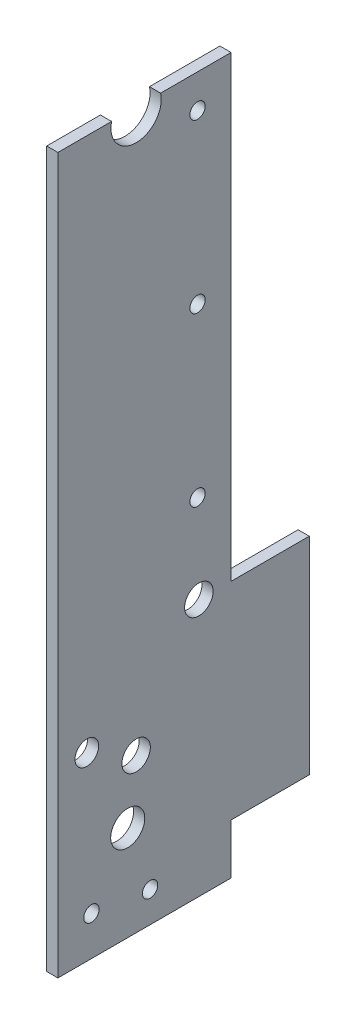
ISO-10303-21;
HEADER;
FILE_DESCRIPTION(('STEP AP214'),'2;1');
FILE_NAME('part.step','',(''),(''),'','','');
FILE_SCHEMA(('AUTOMOTIVE_DESIGN { 1 0 10303 214 1 1 1 1 }'));
ENDSEC;
DATA;
#1=APPLICATION_CONTEXT('core data for automotive mechanical design processes');
#2=APPLICATION_PROTOCOL_DEFINITION('international standard','automotive_design',2000,#1);
#3=PRODUCT_CONTEXT('',#1,'mechanical');
#4=PRODUCT('Part','Part','',(#3));
#5=PRODUCT_RELATED_PRODUCT_CATEGORY('part','',(#4));
#6=PRODUCT_DEFINITION_FORMATION('','',#4);
#7=PRODUCT_DEFINITION_CONTEXT('part definition',#1,'design');
#8=PRODUCT_DEFINITION('design','',#6,#7);
#9=PRODUCT_DEFINITION_SHAPE('','',#8);
#10=(LENGTH_UNIT() NAMED_UNIT(*) SI_UNIT(.MILLI.,.METRE.));
#11=(NAMED_UNIT(*) PLANE_ANGLE_UNIT() SI_UNIT($,.RADIAN.));
#12=(NAMED_UNIT(*) SI_UNIT($,.STERADIAN.) SOLID_ANGLE_UNIT());
#13=UNCERTAINTY_MEASURE_WITH_UNIT(LENGTH_MEASURE(1.E-05),#10,'distance_accuracy_value','');
#14=(GEOMETRIC_REPRESENTATION_CONTEXT(3) GLOBAL_UNCERTAINTY_ASSIGNED_CONTEXT((#13)) GLOBAL_UNIT_ASSIGNED_CONTEXT((#10,
#11,#12)) REPRESENTATION_CONTEXT('',''));
#15=CARTESIAN_POINT('',(0.,0.,0.));
#16=DIRECTION('',(0.,0.,1.));
#17=DIRECTION('',(1.,0.,0.));
#18=AXIS2_PLACEMENT_3D('',#15,#16,#17);
#19=CARTESIAN_POINT('',(0.,72.,18.));
#20=DIRECTION('',(0.,1.,0.));
#21=DIRECTION('',(0.,0.,1.));
#22=AXIS2_PLACEMENT_3D('',#19,#20,#21);
#23=PLANE('',#22);
#24=DIRECTION('',(1.,0.,0.));
#25=VECTOR('',#24,1.);
#26=CARTESIAN_POINT('',(-2.3,72.,60.7749643873921));
#27=LINE('',#26,#25);
#28=CARTESIAN_POINT('',(-2.,72.,60.7749643873921));
#29=VERTEX_POINT('',#28);
#30=CARTESIAN_POINT('',(2.,72.,60.7749643873921));
#31=VERTEX_POINT('',#30);
#32=EDGE_CURVE('E30',#29,#31,#27,.T.);
#33=ORIENTED_EDGE('',*,*,#32,.F.);
#34=DIRECTION('',(0.,0.,1.));
#35=VECTOR('',#34,1.);
#36=CARTESIAN_POINT('',(-2.,72.,18.));
#37=LINE('',#36,#35);
#38=CARTESIAN_POINT('',(-2.,72.,80.));
#39=VERTEX_POINT('',#38);
#40=EDGE_CURVE('E108',#29,#39,#37,.T.);
#41=ORIENTED_EDGE('',*,*,#40,.T.);
#42=DIRECTION('',(1.,0.,0.));
#43=VECTOR('',#42,1.);
#44=CARTESIAN_POINT('',(0.,72.,80.));
#45=LINE('',#44,#43);
#46=CARTESIAN_POINT('',(2.,72.,80.));
#47=VERTEX_POINT('',#46);
#48=EDGE_CURVE('E122',#39,#47,#45,.T.);
#49=ORIENTED_EDGE('',*,*,#48,.T.);
#50=DIRECTION('',(0.,0.,1.));
#51=VECTOR('',#50,1.);
#52=CARTESIAN_POINT('',(2.,72.,18.));
#53=LINE('',#52,#51);
#54=EDGE_CURVE('E109',#31,#47,#53,.T.);
#55=ORIENTED_EDGE('',*,*,#54,.F.);
#56=EDGE_LOOP('',(#33,#41,#49,#55));
#57=FACE_BOUND('',#56,.T.);
#58=ADVANCED_FACE('F16',(#57),#23,.T.);
#59=CARTESIAN_POINT('',(0.,-56.,18.));
#60=DIRECTION('',(0.,0.,-1.));
#61=DIRECTION('',(-1.,0.,0.));
#62=AXIS2_PLACEMENT_3D('',#59,#60,#61);
#63=PLANE('',#62);
#64=DIRECTION('',(-1.,0.,0.));
#65=VECTOR('',#64,1.);
#66=CARTESIAN_POINT('',(0.,-166.,18.));
#67=LINE('',#66,#65);
#68=CARTESIAN_POINT('',(2.,-166.,18.));
#69=VERTEX_POINT('',#68);
#70=CARTESIAN_POINT('',(-2.,-166.,18.));
#71=VERTEX_POINT('',#70);
#72=EDGE_CURVE('E208',#69,#71,#67,.T.);
#73=ORIENTED_EDGE('',*,*,#72,.F.);
#74=DIRECTION('',(0.,1.,0.));
#75=VECTOR('',#74,1.);
#76=CARTESIAN_POINT('',(2.,-56.,18.));
#77=LINE('',#76,#75);
#78=CARTESIAN_POINT('',(2.,-184.,18.));
#79=VERTEX_POINT('',#78);
#80=EDGE_CURVE('E214',#79,#69,#77,.T.);
#81=ORIENTED_EDGE('',*,*,#80,.F.);
#82=DIRECTION('',(1.,0.,0.));
#83=VECTOR('',#82,1.);
#84=CARTESIAN_POINT('',(0.,-184.,18.));
#85=LINE('',#84,#83);
#86=CARTESIAN_POINT('',(-2.,-184.,18.));
#87=VERTEX_POINT('',#86);
#88=EDGE_CURVE('E210',#87,#79,#85,.T.);
#89=ORIENTED_EDGE('',*,*,#88,.F.);
#90=DIRECTION('',(0.,-1.,0.));
#91=VECTOR('',#90,1.);
#92=CARTESIAN_POINT('',(-2.,-56.,18.));
#93=LINE('',#92,#91);
#94=EDGE_CURVE('E213',#71,#87,#93,.T.);
#95=ORIENTED_EDGE('',*,*,#94,.F.);
#96=EDGE_LOOP('',(#73,#81,#89,#95));
#97=FACE_BOUND('',#96,.T.);
#98=ADVANCED_FACE('F234',(#97),#63,.T.);
#99=CARTESIAN_POINT('',(0.,-56.,80.));
#100=DIRECTION('',(0.,0.,1.));
#101=DIRECTION('',(1.,0.,0.));
#102=AXIS2_PLACEMENT_3D('',#99,#100,#101);
#103=PLANE('',#102);
#104=DIRECTION('',(-1.,0.,0.));
#105=VECTOR('',#104,1.);
#106=CARTESIAN_POINT('',(0.,-184.,80.));
#107=LINE('',#106,#105);
#108=CARTESIAN_POINT('',(2.,-184.,80.));
#109=VERTEX_POINT('',#108);
#110=CARTESIAN_POINT('',(-2.,-184.,80.));
#111=VERTEX_POINT('',#110);
#112=EDGE_CURVE('E24',#109,#111,#107,.T.);
#113=ORIENTED_EDGE('',*,*,#112,.F.);
#114=DIRECTION('',(0.,-1.,0.));
#115=VECTOR('',#114,1.);
#116=CARTESIAN_POINT('',(2.,-56.,80.));
#117=LINE('',#116,#115);
#118=EDGE_CURVE('E119',#47,#109,#117,.T.);
#119=ORIENTED_EDGE('',*,*,#118,.F.);
#120=ORIENTED_EDGE('',*,*,#48,.F.);
#121=DIRECTION('',(0.,1.,0.));
#122=VECTOR('',#121,1.);
#123=CARTESIAN_POINT('',(-2.,-56.,80.));
#124=LINE('',#123,#122);
#125=EDGE_CURVE('E125',#111,#39,#124,.T.);
#126=ORIENTED_EDGE('',*,*,#125,.F.);
#127=EDGE_LOOP('',(#113,#119,#120,#126));
#128=FACE_BOUND('',#127,.T.);
#129=ADVANCED_FACE('F18',(#128),#103,.T.);
#130=CARTESIAN_POINT('',(0.,-184.,18.));
#131=DIRECTION('',(0.,-1.,0.));
#132=DIRECTION('',(0.,0.,-1.));
#133=AXIS2_PLACEMENT_3D('',#130,#131,#132);
#134=PLANE('',#133);
#135=DIRECTION('',(0.,0.,1.));
#136=VECTOR('',#135,1.);
#137=CARTESIAN_POINT('',(2.,-184.,18.));
#138=LINE('',#137,#136);
#139=EDGE_CURVE('E112',#79,#109,#138,.T.);
#140=ORIENTED_EDGE('',*,*,#139,.T.);
#141=ORIENTED_EDGE('',*,*,#112,.T.);
#142=DIRECTION('',(0.,0.,1.));
#143=VECTOR('',#142,1.);
#144=CARTESIAN_POINT('',(-2.,-184.,18.));
#145=LINE('',#144,#143);
#146=EDGE_CURVE('E116',#87,#111,#145,.T.);
#147=ORIENTED_EDGE('',*,*,#146,.F.);
#148=ORIENTED_EDGE('',*,*,#88,.T.);
#149=EDGE_LOOP('',(#140,#141,#147,#148));
#150=FACE_BOUND('',#149,.T.);
#151=ADVANCED_FACE('F231',(#150),#134,.T.);
#152=CARTESIAN_POINT('',(-2.,-56.,18.));
#153=DIRECTION('',(-1.,0.,0.));
#154=DIRECTION('',(0.,0.,1.));
#155=AXIS2_PLACEMENT_3D('',#152,#153,#154);
#156=PLANE('',#155);
#157=CARTESIAN_POINT('',(-2.,70.,52.));
#158=DIRECTION('',(-1.,0.,0.));
#159=DIRECTION('',(0.,0.,1.));
#160=AXIS2_PLACEMENT_3D('',#157,#158,#159);
#161=CIRCLE('',#160,9.);
#162=CARTESIAN_POINT('',(-2.,72.,43.2250356126079));
#163=VERTEX_POINT('',#162);
#164=EDGE_CURVE('E163',#163,#29,#161,.T.);
#165=ORIENTED_EDGE('',*,*,#164,.F.);
#166=CARTESIAN_POINT('',(-2.,72.,18.));
#167=VERTEX_POINT('',#166);
#168=EDGE_CURVE('E102',#167,#163,#37,.T.);
#169=ORIENTED_EDGE('',*,*,#168,.F.);
#170=CARTESIAN_POINT('',(-2.,-92.,18.));
#171=VERTEX_POINT('',#170);
#172=EDGE_CURVE('E218',#167,#171,#93,.T.);
#173=ORIENTED_EDGE('',*,*,#172,.T.);
#174=DIRECTION('',(0.,0.,1.));
#175=VECTOR('',#174,1.);
#176=CARTESIAN_POINT('',(-2.,-92.,-10.));
#177=LINE('',#176,#175);
#178=CARTESIAN_POINT('',(-2.,-92.,-10.));
#179=VERTEX_POINT('',#178);
#180=EDGE_CURVE('E201',#179,#171,#177,.T.);
#181=ORIENTED_EDGE('',*,*,#180,.F.);
#182=DIRECTION('',(0.,-1.,0.));
#183=VECTOR('',#182,1.);
#184=CARTESIAN_POINT('',(-2.,-129.,-10.));
#185=LINE('',#184,#183);
#186=CARTESIAN_POINT('',(-2.,-166.,-10.));
#187=VERTEX_POINT('',#186);
#188=EDGE_CURVE('E190',#179,#187,#185,.T.);
#189=ORIENTED_EDGE('',*,*,#188,.T.);
#190=DIRECTION('',(0.,0.,1.));
#191=VECTOR('',#190,1.);
#192=CARTESIAN_POINT('',(-2.,-166.,-10.));
#193=LINE('',#192,#191);
#194=EDGE_CURVE('E203',#187,#71,#193,.T.);
#195=ORIENTED_EDGE('',*,*,#194,.T.);
#196=ORIENTED_EDGE('',*,*,#94,.T.);
#197=ORIENTED_EDGE('',*,*,#146,.T.);
#198=ORIENTED_EDGE('',*,*,#125,.T.);
#199=ORIENTED_EDGE('',*,*,#40,.F.);
#200=EDGE_LOOP('',(#165,#169,#173,#181,#189,#195,#196,#197,#198,#199));
#201=FACE_BOUND('',#200,.T.);
#202=CARTESIAN_POINT('',(-2.,60.,30.));
#203=DIRECTION('',(-1.,0.,0.));
#204=DIRECTION('',(0.,0.,1.));
#205=AXIS2_PLACEMENT_3D('',#202,#203,#204);
#206=CIRCLE('',#205,2.75);
#207=CARTESIAN_POINT('',(-2.,60.,32.75));
#208=VERTEX_POINT('',#207);
#209=EDGE_CURVE('E160',#208,#208,#206,.T.);
#210=ORIENTED_EDGE('',*,*,#209,.F.);
#211=EDGE_LOOP('',(#210));
#212=FACE_BOUND('',#211,.T.);
#213=CARTESIAN_POINT('',(-2.,0.,30.));
#214=DIRECTION('',(-1.,0.,0.));
#215=DIRECTION('',(0.,0.,1.));
#216=AXIS2_PLACEMENT_3D('',#213,#214,#215);
#217=CIRCLE('',#216,2.75);
#218=CARTESIAN_POINT('',(-2.,0.,32.75));
#219=VERTEX_POINT('',#218);
#220=EDGE_CURVE('E157',#219,#219,#217,.T.);
#221=ORIENTED_EDGE('',*,*,#220,.F.);
#222=EDGE_LOOP('',(#221));
#223=FACE_BOUND('',#222,.T.);
#224=CARTESIAN_POINT('',(-2.,-60.,30.));
#225=DIRECTION('',(-1.,0.,0.));
#226=DIRECTION('',(0.,0.,1.));
#227=AXIS2_PLACEMENT_3D('',#224,#225,#226);
#228=CIRCLE('',#227,2.75);
#229=CARTESIAN_POINT('',(-2.,-60.,32.75));
#230=VERTEX_POINT('',#229);
#231=EDGE_CURVE('E153',#230,#230,#228,.T.);
#232=ORIENTED_EDGE('',*,*,#231,.F.);
#233=EDGE_LOOP('',(#232));
#234=FACE_BOUND('',#233,.T.);
#235=CARTESIAN_POINT('',(-2.,-170.,68.));
#236=DIRECTION('',(-1.,0.,0.));
#237=DIRECTION('',(0.,0.,1.));
#238=AXIS2_PLACEMENT_3D('',#235,#236,#237);
#239=CIRCLE('',#238,2.75);
#240=CARTESIAN_POINT('',(-2.,-170.,70.75));
#241=VERTEX_POINT('',#240);
#242=EDGE_CURVE('E149',#241,#241,#239,.T.);
#243=ORIENTED_EDGE('',*,*,#242,.F.);
#244=EDGE_LOOP('',(#243));
#245=FACE_BOUND('',#244,.T.);
#246=CARTESIAN_POINT('',(-2.,-173.,47.));
#247=DIRECTION('',(-1.,0.,0.));
#248=DIRECTION('',(0.,0.,1.));
#249=AXIS2_PLACEMENT_3D('',#246,#247,#248);
#250=CIRCLE('',#249,2.75);
#251=CARTESIAN_POINT('',(-2.,-173.,49.75));
#252=VERTEX_POINT('',#251);
#253=EDGE_CURVE('E145',#252,#252,#250,.T.);
#254=ORIENTED_EDGE('',*,*,#253,.F.);
#255=EDGE_LOOP('',(#254));
#256=FACE_BOUND('',#255,.T.);
#257=CARTESIAN_POINT('',(-2.,-119.301271317342,69.6333395005085));
#258=DIRECTION('',(-1.,0.,0.));
#259=DIRECTION('',(0.,0.,1.));
#260=AXIS2_PLACEMENT_3D('',#257,#258,#259);
#261=CIRCLE('',#260,4.25);
#262=CARTESIAN_POINT('',(-2.,-119.301271317342,73.8833395005085));
#263=VERTEX_POINT('',#262);
#264=EDGE_CURVE('E141',#263,#263,#261,.T.);
#265=ORIENTED_EDGE('',*,*,#264,.F.);
#266=EDGE_LOOP('',(#265));
#267=FACE_BOUND('',#266,.T.);
#268=CARTESIAN_POINT('',(-2.,-91.8524662929179,29.5264435506706));
#269=DIRECTION('',(-1.,0.,0.));
#270=DIRECTION('',(0.,0.,1.));
#271=AXIS2_PLACEMENT_3D('',#268,#269,#270);
#272=CIRCLE('',#271,5.1);
#273=CARTESIAN_POINT('',(-2.,-91.8524662929179,34.6264435506706));
#274=VERTEX_POINT('',#273);
#275=EDGE_CURVE('E137',#274,#274,#272,.T.);
#276=ORIENTED_EDGE('',*,*,#275,.F.);
#277=EDGE_LOOP('',(#276));
#278=FACE_BOUND('',#277,.T.);
#279=CARTESIAN_POINT('',(-2.,-150.,55.));
#280=DIRECTION('',(-1.,0.,0.));
#281=DIRECTION('',(0.,0.,1.));
#282=AXIS2_PLACEMENT_3D('',#279,#280,#281);
#283=CIRCLE('',#282,6.1);
#284=CARTESIAN_POINT('',(-2.,-150.,61.1));
#285=VERTEX_POINT('',#284);
#286=EDGE_CURVE('E133',#285,#285,#283,.T.);
#287=ORIENTED_EDGE('',*,*,#286,.F.);
#288=EDGE_LOOP('',(#287));
#289=FACE_BOUND('',#288,.T.);
#290=CARTESIAN_POINT('',(-2.,-129.,52.));
#291=DIRECTION('',(-1.,0.,0.));
#292=DIRECTION('',(0.,0.,1.));
#293=AXIS2_PLACEMENT_3D('',#290,#291,#292);
#294=CIRCLE('',#293,5.1);
#295=CARTESIAN_POINT('',(-2.,-129.,57.1));
#296=VERTEX_POINT('',#295);
#297=EDGE_CURVE('E132',#296,#296,#294,.T.);
#298=ORIENTED_EDGE('',*,*,#297,.F.);
#299=EDGE_LOOP('',(#298));
#300=FACE_BOUND('',#299,.T.);
#301=ADVANCED_FACE('F224',(#201,#212,#223,#234,#245,#256,#267,#278,#289,#300),#156,.T.);
#302=DIRECTION('',(1.,0.,0.));
#303=VECTOR('',#302,1.);
#304=CARTESIAN_POINT('',(-2.3,72.,43.2250356126079));
#305=LINE('',#304,#303);
#306=CARTESIAN_POINT('',(2.,72.,43.2250356126079));
#307=VERTEX_POINT('',#306);
#308=EDGE_CURVE('E91',#307,#163,#305,.F.);
#309=ORIENTED_EDGE('',*,*,#308,.F.);
#310=CARTESIAN_POINT('',(2.,72.,18.));
#311=VERTEX_POINT('',#310);
#312=EDGE_CURVE('E100',#311,#307,#53,.T.);
#313=ORIENTED_EDGE('',*,*,#312,.F.);
#314=DIRECTION('',(-1.,0.,0.));
#315=VECTOR('',#314,1.);
#316=CARTESIAN_POINT('',(0.,72.,18.));
#317=LINE('',#316,#315);
#318=EDGE_CURVE('E217',#311,#167,#317,.T.);
#319=ORIENTED_EDGE('',*,*,#318,.T.);
#320=ORIENTED_EDGE('',*,*,#168,.T.);
#321=EDGE_LOOP('',(#309,#313,#319,#320));
#322=FACE_BOUND('',#321,.T.);
#323=ADVANCED_FACE('F98',(#322),#23,.T.);
#324=DIRECTION('',(1.,0.,0.));
#325=VECTOR('',#324,1.);
#326=CARTESIAN_POINT('',(0.,-92.,18.));
#327=LINE('',#326,#325);
#328=CARTESIAN_POINT('',(2.,-92.,18.));
#329=VERTEX_POINT('',#328);
#330=EDGE_CURVE('E206',#171,#329,#327,.T.);
#331=ORIENTED_EDGE('',*,*,#330,.F.);
#332=ORIENTED_EDGE('',*,*,#172,.F.);
#333=ORIENTED_EDGE('',*,*,#318,.F.);
#334=EDGE_CURVE('E107',#329,#311,#77,.T.);
#335=ORIENTED_EDGE('',*,*,#334,.F.);
#336=EDGE_LOOP('',(#331,#332,#333,#335));
#337=FACE_BOUND('',#336,.T.);
#338=ADVANCED_FACE('F247',(#337),#63,.T.);
#339=CARTESIAN_POINT('',(2.,-56.,18.));
#340=DIRECTION('',(1.,0.,0.));
#341=DIRECTION('',(0.,0.,-1.));
#342=AXIS2_PLACEMENT_3D('',#339,#340,#341);
#343=PLANE('',#342);
#344=CARTESIAN_POINT('',(2.,70.,52.));
#345=DIRECTION('',(1.,0.,0.));
#346=DIRECTION('',(0.,0.,-1.));
#347=AXIS2_PLACEMENT_3D('',#344,#345,#346);
#348=CIRCLE('',#347,9.);
#349=EDGE_CURVE('E10',#31,#307,#348,.T.);
#350=ORIENTED_EDGE('',*,*,#349,.F.);
#351=ORIENTED_EDGE('',*,*,#54,.T.);
#352=ORIENTED_EDGE('',*,*,#118,.T.);
#353=ORIENTED_EDGE('',*,*,#139,.F.);
#354=ORIENTED_EDGE('',*,*,#80,.T.);
#355=DIRECTION('',(0.,0.,1.));
#356=VECTOR('',#355,1.);
#357=CARTESIAN_POINT('',(2.,-166.,-10.));
#358=LINE('',#357,#356);
#359=CARTESIAN_POINT('',(2.,-166.,-10.));
#360=VERTEX_POINT('',#359);
#361=EDGE_CURVE('E193',#360,#69,#358,.T.);
#362=ORIENTED_EDGE('',*,*,#361,.F.);
#363=DIRECTION('',(0.,1.,0.));
#364=VECTOR('',#363,1.);
#365=CARTESIAN_POINT('',(2.,-129.,-10.));
#366=LINE('',#365,#364);
#367=CARTESIAN_POINT('',(2.,-92.,-10.));
#368=VERTEX_POINT('',#367);
#369=EDGE_CURVE('E191',#360,#368,#366,.T.);
#370=ORIENTED_EDGE('',*,*,#369,.T.);
#371=DIRECTION('',(0.,0.,1.));
#372=VECTOR('',#371,1.);
#373=CARTESIAN_POINT('',(2.,-92.,-10.));
#374=LINE('',#373,#372);
#375=EDGE_CURVE('E38',#368,#329,#374,.T.);
#376=ORIENTED_EDGE('',*,*,#375,.T.);
#377=ORIENTED_EDGE('',*,*,#334,.T.);
#378=ORIENTED_EDGE('',*,*,#312,.T.);
#379=EDGE_LOOP('',(#350,#351,#352,#353,#354,#362,#370,#376,#377,#378));
#380=FACE_BOUND('',#379,.T.);
#381=CARTESIAN_POINT('',(2.,60.,30.));
#382=DIRECTION('',(1.,0.,0.));
#383=DIRECTION('',(0.,0.,-1.));
#384=AXIS2_PLACEMENT_3D('',#381,#382,#383);
#385=CIRCLE('',#384,2.75);
#386=CARTESIAN_POINT('',(2.,60.,27.25));
#387=VERTEX_POINT('',#386);
#388=EDGE_CURVE('E161',#387,#387,#385,.T.);
#389=ORIENTED_EDGE('',*,*,#388,.F.);
#390=EDGE_LOOP('',(#389));
#391=FACE_BOUND('',#390,.T.);
#392=CARTESIAN_POINT('',(2.,0.,30.));
#393=DIRECTION('',(1.,0.,0.));
#394=DIRECTION('',(0.,0.,-1.));
#395=AXIS2_PLACEMENT_3D('',#392,#393,#394);
#396=CIRCLE('',#395,2.75);
#397=CARTESIAN_POINT('',(2.,0.,27.25));
#398=VERTEX_POINT('',#397);
#399=EDGE_CURVE('E158',#398,#398,#396,.T.);
#400=ORIENTED_EDGE('',*,*,#399,.F.);
#401=EDGE_LOOP('',(#400));
#402=FACE_BOUND('',#401,.T.);
#403=CARTESIAN_POINT('',(2.,-60.,30.));
#404=DIRECTION('',(1.,0.,0.));
#405=DIRECTION('',(0.,0.,-1.));
#406=AXIS2_PLACEMENT_3D('',#403,#404,#405);
#407=CIRCLE('',#406,2.75);
#408=CARTESIAN_POINT('',(2.,-60.,27.25));
#409=VERTEX_POINT('',#408);
#410=EDGE_CURVE('E154',#409,#409,#407,.T.);
#411=ORIENTED_EDGE('',*,*,#410,.F.);
#412=EDGE_LOOP('',(#411));
#413=FACE_BOUND('',#412,.T.);
#414=CARTESIAN_POINT('',(2.,-170.,68.));
#415=DIRECTION('',(1.,0.,0.));
#416=DIRECTION('',(0.,0.,-1.));
#417=AXIS2_PLACEMENT_3D('',#414,#415,#416);
#418=CIRCLE('',#417,2.75);
#419=CARTESIAN_POINT('',(2.,-170.,65.25));
#420=VERTEX_POINT('',#419);
#421=EDGE_CURVE('E150',#420,#420,#418,.T.);
#422=ORIENTED_EDGE('',*,*,#421,.F.);
#423=EDGE_LOOP('',(#422));
#424=FACE_BOUND('',#423,.T.);
#425=CARTESIAN_POINT('',(2.,-173.,47.));
#426=DIRECTION('',(1.,0.,0.));
#427=DIRECTION('',(0.,0.,-1.));
#428=AXIS2_PLACEMENT_3D('',#425,#426,#427);
#429=CIRCLE('',#428,2.75);
#430=CARTESIAN_POINT('',(2.,-173.,44.25));
#431=VERTEX_POINT('',#430);
#432=EDGE_CURVE('E146',#431,#431,#429,.T.);
#433=ORIENTED_EDGE('',*,*,#432,.F.);
#434=EDGE_LOOP('',(#433));
#435=FACE_BOUND('',#434,.T.);
#436=CARTESIAN_POINT('',(2.,-119.301271317342,69.6333395005085));
#437=DIRECTION('',(1.,0.,0.));
#438=DIRECTION('',(0.,0.,-1.));
#439=AXIS2_PLACEMENT_3D('',#436,#437,#438);
#440=CIRCLE('',#439,4.25);
#441=CARTESIAN_POINT('',(2.,-119.301271317342,65.3833395005085));
#442=VERTEX_POINT('',#441);
#443=EDGE_CURVE('E142',#442,#442,#440,.T.);
#444=ORIENTED_EDGE('',*,*,#443,.F.);
#445=EDGE_LOOP('',(#444));
#446=FACE_BOUND('',#445,.T.);
#447=CARTESIAN_POINT('',(2.,-91.8524662929179,29.5264435506706));
#448=DIRECTION('',(1.,0.,0.));
#449=DIRECTION('',(0.,0.,-1.));
#450=AXIS2_PLACEMENT_3D('',#447,#448,#449);
#451=CIRCLE('',#450,5.1);
#452=CARTESIAN_POINT('',(2.,-91.8524662929179,24.4264435506706));
#453=VERTEX_POINT('',#452);
#454=EDGE_CURVE('E138',#453,#453,#451,.T.);
#455=ORIENTED_EDGE('',*,*,#454,.F.);
#456=EDGE_LOOP('',(#455));
#457=FACE_BOUND('',#456,.T.);
#458=CARTESIAN_POINT('',(2.,-150.,55.));
#459=DIRECTION('',(1.,0.,0.));
#460=DIRECTION('',(0.,0.,-1.));
#461=AXIS2_PLACEMENT_3D('',#458,#459,#460);
#462=CIRCLE('',#461,6.1);
#463=CARTESIAN_POINT('',(2.,-150.,48.9));
#464=VERTEX_POINT('',#463);
#465=EDGE_CURVE('E134',#464,#464,#462,.T.);
#466=ORIENTED_EDGE('',*,*,#465,.F.);
#467=EDGE_LOOP('',(#466));
#468=FACE_BOUND('',#467,.T.);
#469=CARTESIAN_POINT('',(2.,-129.,52.));
#470=DIRECTION('',(1.,0.,0.));
#471=DIRECTION('',(0.,0.,-1.));
#472=AXIS2_PLACEMENT_3D('',#469,#470,#471);
#473=CIRCLE('',#472,5.1);
#474=CARTESIAN_POINT('',(2.,-129.,46.9));
#475=VERTEX_POINT('',#474);
#476=EDGE_CURVE('E129',#475,#475,#473,.T.);
#477=ORIENTED_EDGE('',*,*,#476,.F.);
#478=EDGE_LOOP('',(#477));
#479=FACE_BOUND('',#478,.T.);
#480=ADVANCED_FACE('F104',(#380,#391,#402,#413,#424,#435,#446,#457,#468,#479),#343,.T.);
#481=CARTESIAN_POINT('',(0.,-166.,-10.));
#482=DIRECTION('',(0.,-1.,0.));
#483=DIRECTION('',(0.,0.,-1.));
#484=AXIS2_PLACEMENT_3D('',#481,#482,#483);
#485=PLANE('',#484);
#486=ORIENTED_EDGE('',*,*,#361,.T.);
#487=ORIENTED_EDGE('',*,*,#72,.T.);
#488=ORIENTED_EDGE('',*,*,#194,.F.);
#489=DIRECTION('',(1.,0.,0.));
#490=VECTOR('',#489,1.);
#491=CARTESIAN_POINT('',(0.,-166.,-10.));
#492=LINE('',#491,#490);
#493=EDGE_CURVE('E187',#187,#360,#492,.T.);
#494=ORIENTED_EDGE('',*,*,#493,.T.);
#495=EDGE_LOOP('',(#486,#487,#488,#494));
#496=FACE_BOUND('',#495,.T.);
#497=ADVANCED_FACE('F308',(#496),#485,.T.);
#498=CARTESIAN_POINT('',(0.,-92.,-10.));
#499=DIRECTION('',(0.,1.,0.));
#500=DIRECTION('',(0.,0.,1.));
#501=AXIS2_PLACEMENT_3D('',#498,#499,#500);
#502=PLANE('',#501);
#503=ORIENTED_EDGE('',*,*,#180,.T.);
#504=ORIENTED_EDGE('',*,*,#330,.T.);
#505=ORIENTED_EDGE('',*,*,#375,.F.);
#506=DIRECTION('',(-1.,0.,0.));
#507=VECTOR('',#506,1.);
#508=CARTESIAN_POINT('',(0.,-92.,-10.));
#509=LINE('',#508,#507);
#510=EDGE_CURVE('E194',#368,#179,#509,.T.);
#511=ORIENTED_EDGE('',*,*,#510,.T.);
#512=EDGE_LOOP('',(#503,#504,#505,#511));
#513=FACE_BOUND('',#512,.T.);
#514=ADVANCED_FACE('F315',(#513),#502,.T.);
#515=CARTESIAN_POINT('',(0.,-129.,-10.));
#516=DIRECTION('',(0.,0.,-1.));
#517=DIRECTION('',(-1.,0.,0.));
#518=AXIS2_PLACEMENT_3D('',#515,#516,#517);
#519=PLANE('',#518);
#520=ORIENTED_EDGE('',*,*,#369,.F.);
#521=ORIENTED_EDGE('',*,*,#493,.F.);
#522=ORIENTED_EDGE('',*,*,#188,.F.);
#523=ORIENTED_EDGE('',*,*,#510,.F.);
#524=EDGE_LOOP('',(#520,#521,#522,#523));
#525=FACE_BOUND('',#524,.T.);
#526=ADVANCED_FACE('F324',(#525),#519,.T.);
#527=CARTESIAN_POINT('',(-2.3,-129.,52.));
#528=DIRECTION('',(1.,0.,0.));
#529=DIRECTION('',(0.,0.,-1.));
#530=AXIS2_PLACEMENT_3D('',#527,#528,#529);
#531=CYLINDRICAL_SURFACE('',#530,5.1);
#532=ORIENTED_EDGE('',*,*,#297,.T.);
#533=EDGE_LOOP('',(#532));
#534=FACE_BOUND('',#533,.T.);
#535=ORIENTED_EDGE('',*,*,#476,.T.);
#536=EDGE_LOOP('',(#535));
#537=FACE_BOUND('',#536,.T.);
#538=ADVANCED_FACE('F333',(#534,#537),#531,.F.);
#539=CARTESIAN_POINT('',(-2.3,-150.,55.));
#540=DIRECTION('',(1.,0.,0.));
#541=DIRECTION('',(0.,0.,-1.));
#542=AXIS2_PLACEMENT_3D('',#539,#540,#541);
#543=CYLINDRICAL_SURFACE('',#542,6.1);
#544=ORIENTED_EDGE('',*,*,#286,.T.);
#545=EDGE_LOOP('',(#544));
#546=FACE_BOUND('',#545,.T.);
#547=ORIENTED_EDGE('',*,*,#465,.T.);
#548=EDGE_LOOP('',(#547));
#549=FACE_BOUND('',#548,.T.);
#550=ADVANCED_FACE('F342',(#546,#549),#543,.F.);
#551=CARTESIAN_POINT('',(-2.3,-91.8524662929179,29.5264435506706));
#552=DIRECTION('',(1.,0.,0.));
#553=DIRECTION('',(0.,0.,-1.));
#554=AXIS2_PLACEMENT_3D('',#551,#552,#553);
#555=CYLINDRICAL_SURFACE('',#554,5.1);
#556=ORIENTED_EDGE('',*,*,#275,.T.);
#557=EDGE_LOOP('',(#556));
#558=FACE_BOUND('',#557,.T.);
#559=ORIENTED_EDGE('',*,*,#454,.T.);
#560=EDGE_LOOP('',(#559));
#561=FACE_BOUND('',#560,.T.);
#562=ADVANCED_FACE('F351',(#558,#561),#555,.F.);
#563=CARTESIAN_POINT('',(-2.3,-119.301271317342,69.6333395005085));
#564=DIRECTION('',(1.,0.,0.));
#565=DIRECTION('',(0.,0.,-1.));
#566=AXIS2_PLACEMENT_3D('',#563,#564,#565);
#567=CYLINDRICAL_SURFACE('',#566,4.25);
#568=ORIENTED_EDGE('',*,*,#264,.T.);
#569=EDGE_LOOP('',(#568));
#570=FACE_BOUND('',#569,.T.);
#571=ORIENTED_EDGE('',*,*,#443,.T.);
#572=EDGE_LOOP('',(#571));
#573=FACE_BOUND('',#572,.T.);
#574=ADVANCED_FACE('F360',(#570,#573),#567,.F.);
#575=CARTESIAN_POINT('',(-2.3,-173.,47.));
#576=DIRECTION('',(1.,0.,0.));
#577=DIRECTION('',(0.,0.,-1.));
#578=AXIS2_PLACEMENT_3D('',#575,#576,#577);
#579=CYLINDRICAL_SURFACE('',#578,2.75);
#580=ORIENTED_EDGE('',*,*,#253,.T.);
#581=EDGE_LOOP('',(#580));
#582=FACE_BOUND('',#581,.T.);
#583=ORIENTED_EDGE('',*,*,#432,.T.);
#584=EDGE_LOOP('',(#583));
#585=FACE_BOUND('',#584,.T.);
#586=ADVANCED_FACE('F369',(#582,#585),#579,.F.);
#587=CARTESIAN_POINT('',(-2.3,-170.,68.));
#588=DIRECTION('',(1.,0.,0.));
#589=DIRECTION('',(0.,0.,-1.));
#590=AXIS2_PLACEMENT_3D('',#587,#588,#589);
#591=CYLINDRICAL_SURFACE('',#590,2.75);
#592=ORIENTED_EDGE('',*,*,#242,.T.);
#593=EDGE_LOOP('',(#592));
#594=FACE_BOUND('',#593,.T.);
#595=ORIENTED_EDGE('',*,*,#421,.T.);
#596=EDGE_LOOP('',(#595));
#597=FACE_BOUND('',#596,.T.);
#598=ADVANCED_FACE('F378',(#594,#597),#591,.F.);
#599=CARTESIAN_POINT('',(-2.3,-60.,30.));
#600=DIRECTION('',(1.,0.,0.));
#601=DIRECTION('',(0.,0.,-1.));
#602=AXIS2_PLACEMENT_3D('',#599,#600,#601);
#603=CYLINDRICAL_SURFACE('',#602,2.75);
#604=ORIENTED_EDGE('',*,*,#231,.T.);
#605=EDGE_LOOP('',(#604));
#606=FACE_BOUND('',#605,.T.);
#607=ORIENTED_EDGE('',*,*,#410,.T.);
#608=EDGE_LOOP('',(#607));
#609=FACE_BOUND('',#608,.T.);
#610=ADVANCED_FACE('F387',(#606,#609),#603,.F.);
#611=CARTESIAN_POINT('',(-2.3,0.,30.));
#612=DIRECTION('',(1.,0.,0.));
#613=DIRECTION('',(0.,0.,-1.));
#614=AXIS2_PLACEMENT_3D('',#611,#612,#613);
#615=CYLINDRICAL_SURFACE('',#614,2.75);
#616=ORIENTED_EDGE('',*,*,#220,.T.);
#617=EDGE_LOOP('',(#616));
#618=FACE_BOUND('',#617,.T.);
#619=ORIENTED_EDGE('',*,*,#399,.T.);
#620=EDGE_LOOP('',(#619));
#621=FACE_BOUND('',#620,.T.);
#622=ADVANCED_FACE('F396',(#618,#621),#615,.F.);
#623=CARTESIAN_POINT('',(-2.3,60.,30.));
#624=DIRECTION('',(1.,0.,0.));
#625=DIRECTION('',(0.,0.,-1.));
#626=AXIS2_PLACEMENT_3D('',#623,#624,#625);
#627=CYLINDRICAL_SURFACE('',#626,2.75);
#628=ORIENTED_EDGE('',*,*,#209,.T.);
#629=EDGE_LOOP('',(#628));
#630=FACE_BOUND('',#629,.T.);
#631=ORIENTED_EDGE('',*,*,#388,.T.);
#632=EDGE_LOOP('',(#631));
#633=FACE_BOUND('',#632,.T.);
#634=ADVANCED_FACE('F405',(#630,#633),#627,.F.);
#635=CARTESIAN_POINT('',(-2.3,70.,52.));
#636=DIRECTION('',(1.,0.,0.));
#637=DIRECTION('',(0.,0.,-1.));
#638=AXIS2_PLACEMENT_3D('',#635,#636,#637);
#639=CYLINDRICAL_SURFACE('',#638,9.);
#640=ORIENTED_EDGE('',*,*,#164,.T.);
#641=ORIENTED_EDGE('',*,*,#32,.T.);
#642=ORIENTED_EDGE('',*,*,#349,.T.);
#643=ORIENTED_EDGE('',*,*,#308,.T.);
#644=EDGE_LOOP('',(#640,#641,#642,#643));
#645=FACE_BOUND('',#644,.T.);
#646=ADVANCED_FACE('F90',(#645),#639,.F.);
#647=CLOSED_SHELL('',(#58,#98,#129,#151,#301,#323,#338,#480,#497,#514,#526,#538,#550,#562,#574,
#586,#598,#610,#622,#634,#646));
#648=MANIFOLD_SOLID_BREP('B1',#647);
#649=ADVANCED_BREP_SHAPE_REPRESENTATION('',(#18,#648),#14);
#650=SHAPE_DEFINITION_REPRESENTATION(#9,#649);
ENDSEC;
END-ISO-10303-21;
